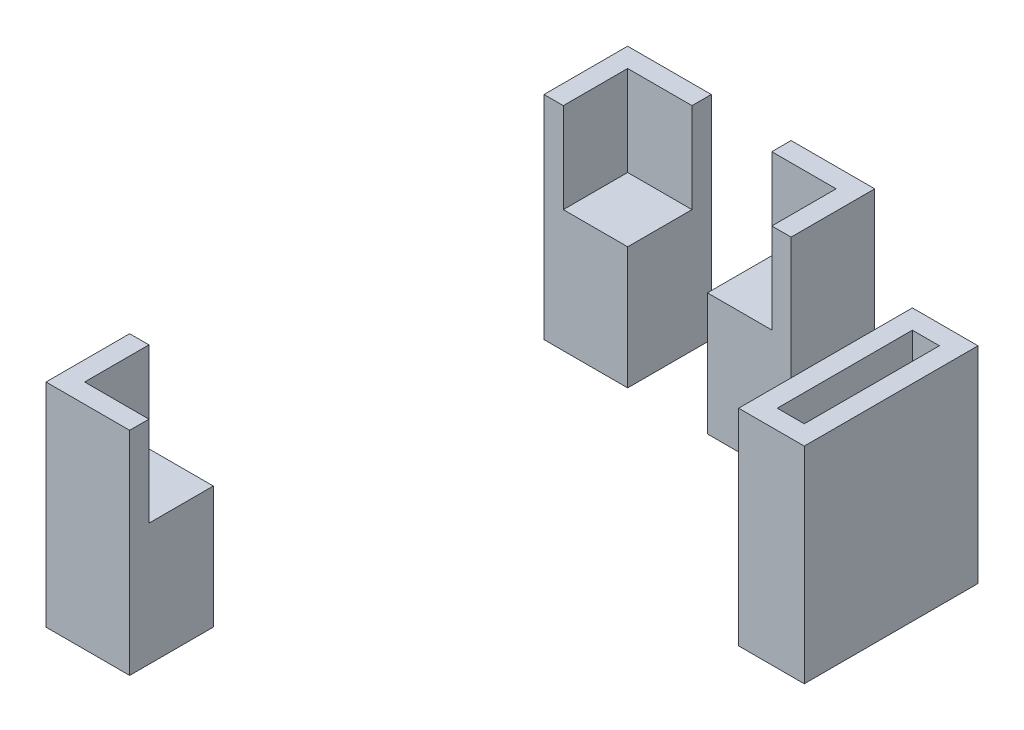
ISO-10303-21;
HEADER;
FILE_DESCRIPTION(('STEP AP214'),'2;1');
FILE_NAME('part.step','',(''),(''),'','','');
FILE_SCHEMA(('AUTOMOTIVE_DESIGN { 1 0 10303 214 1 1 1 1 }'));
ENDSEC;
DATA;
#1=APPLICATION_CONTEXT('core data for automotive mechanical design processes');
#2=APPLICATION_PROTOCOL_DEFINITION('international standard','automotive_design',2000,#1);
#3=PRODUCT_CONTEXT('',#1,'mechanical');
#4=PRODUCT('Part','Part','',(#3));
#5=PRODUCT_RELATED_PRODUCT_CATEGORY('part','',(#4));
#6=PRODUCT_DEFINITION_FORMATION('','',#4);
#7=PRODUCT_DEFINITION_CONTEXT('part definition',#1,'design');
#8=PRODUCT_DEFINITION('design','',#6,#7);
#9=PRODUCT_DEFINITION_SHAPE('','',#8);
#10=(LENGTH_UNIT() NAMED_UNIT(*) SI_UNIT(.MILLI.,.METRE.));
#11=(NAMED_UNIT(*) PLANE_ANGLE_UNIT() SI_UNIT($,.RADIAN.));
#12=(NAMED_UNIT(*) SI_UNIT($,.STERADIAN.) SOLID_ANGLE_UNIT());
#13=UNCERTAINTY_MEASURE_WITH_UNIT(LENGTH_MEASURE(1.E-05),#10,'distance_accuracy_value','');
#14=(GEOMETRIC_REPRESENTATION_CONTEXT(3) GLOBAL_UNCERTAINTY_ASSIGNED_CONTEXT((#13)) GLOBAL_UNIT_ASSIGNED_CONTEXT((#10,
#11,#12)) REPRESENTATION_CONTEXT('',''));
#15=CARTESIAN_POINT('',(0.,0.,0.));
#16=DIRECTION('',(0.,0.,1.));
#17=DIRECTION('',(1.,0.,0.));
#18=AXIS2_PLACEMENT_3D('',#15,#16,#17);
#19=CARTESIAN_POINT('',(26.675,16.5,4.55));
#20=DIRECTION('',(1.,0.,0.));
#21=DIRECTION('',(0.,0.,-1.));
#22=AXIS2_PLACEMENT_3D('',#19,#20,#21);
#23=PLANE('',#22);
#24=DIRECTION('',(0.,0.,1.));
#25=VECTOR('',#24,1.);
#26=CARTESIAN_POINT('',(26.675,16.,4.55));
#27=LINE('',#26,#25);
#28=CARTESIAN_POINT('',(26.675,16.,4.55));
#29=VERTEX_POINT('',#28);
#30=CARTESIAN_POINT('',(26.675,16.,18.05));
#31=VERTEX_POINT('',#30);
#32=EDGE_CURVE('E135',#29,#31,#27,.T.);
#33=ORIENTED_EDGE('',*,*,#32,.F.);
#34=DIRECTION('',(0.,-1.,0.));
#35=VECTOR('',#34,1.);
#36=CARTESIAN_POINT('',(26.675,16.5,4.55));
#37=LINE('',#36,#35);
#38=CARTESIAN_POINT('',(26.675,0.,4.55));
#39=VERTEX_POINT('',#38);
#40=EDGE_CURVE('E168',#29,#39,#37,.T.);
#41=ORIENTED_EDGE('',*,*,#40,.T.);
#42=DIRECTION('',(0.,0.,1.));
#43=VECTOR('',#42,1.);
#44=CARTESIAN_POINT('',(26.675,0.,4.55));
#45=LINE('',#44,#43);
#46=CARTESIAN_POINT('',(26.675,0.,18.05));
#47=VERTEX_POINT('',#46);
#48=EDGE_CURVE('E157',#39,#47,#45,.T.);
#49=ORIENTED_EDGE('',*,*,#48,.T.);
#50=DIRECTION('',(0.,-1.,0.));
#51=VECTOR('',#50,1.);
#52=CARTESIAN_POINT('',(26.675,16.5,18.05));
#53=LINE('',#52,#51);
#54=EDGE_CURVE('E54',#31,#47,#53,.T.);
#55=ORIENTED_EDGE('',*,*,#54,.F.);
#56=EDGE_LOOP('',(#33,#41,#49,#55));
#57=FACE_BOUND('',#56,.T.);
#58=ADVANCED_FACE('F47',(#57),#23,.F.);
#59=CARTESIAN_POINT('',(26.675,16.5,18.05));
#60=DIRECTION('',(0.,0.,-1.));
#61=DIRECTION('',(-1.,0.,0.));
#62=AXIS2_PLACEMENT_3D('',#59,#60,#61);
#63=PLANE('',#62);
#64=DIRECTION('',(1.,0.,0.));
#65=VECTOR('',#64,1.);
#66=CARTESIAN_POINT('',(26.675,16.,18.05));
#67=LINE('',#66,#65);
#68=CARTESIAN_POINT('',(31.775,16.,18.05));
#69=VERTEX_POINT('',#68);
#70=EDGE_CURVE('E138',#31,#69,#67,.T.);
#71=ORIENTED_EDGE('',*,*,#70,.F.);
#72=ORIENTED_EDGE('',*,*,#54,.T.);
#73=DIRECTION('',(1.,0.,0.));
#74=VECTOR('',#73,1.);
#75=CARTESIAN_POINT('',(26.675,0.,18.05));
#76=LINE('',#75,#74);
#77=CARTESIAN_POINT('',(31.775,0.,18.05));
#78=VERTEX_POINT('',#77);
#79=EDGE_CURVE('E160',#47,#78,#76,.T.);
#80=ORIENTED_EDGE('',*,*,#79,.T.);
#81=DIRECTION('',(0.,-1.,0.));
#82=VECTOR('',#81,1.);
#83=CARTESIAN_POINT('',(31.775,16.5,18.05));
#84=LINE('',#83,#82);
#85=EDGE_CURVE('E174',#69,#78,#84,.T.);
#86=ORIENTED_EDGE('',*,*,#85,.F.);
#87=EDGE_LOOP('',(#71,#72,#80,#86));
#88=FACE_BOUND('',#87,.T.);
#89=ADVANCED_FACE('F179',(#88),#63,.F.);
#90=CARTESIAN_POINT('',(31.775,16.5,4.55));
#91=DIRECTION('',(-1.,0.,0.));
#92=DIRECTION('',(0.,0.,1.));
#93=AXIS2_PLACEMENT_3D('',#90,#91,#92);
#94=PLANE('',#93);
#95=DIRECTION('',(0.,0.,-1.));
#96=VECTOR('',#95,1.);
#97=CARTESIAN_POINT('',(31.775,16.,4.55));
#98=LINE('',#97,#96);
#99=CARTESIAN_POINT('',(31.775,16.,4.55));
#100=VERTEX_POINT('',#99);
#101=EDGE_CURVE('E141',#69,#100,#98,.T.);
#102=ORIENTED_EDGE('',*,*,#101,.F.);
#103=ORIENTED_EDGE('',*,*,#85,.T.);
#104=DIRECTION('',(0.,0.,-1.));
#105=VECTOR('',#104,1.);
#106=CARTESIAN_POINT('',(31.775,0.,4.55));
#107=LINE('',#106,#105);
#108=CARTESIAN_POINT('',(31.775,0.,4.55));
#109=VERTEX_POINT('',#108);
#110=EDGE_CURVE('E163',#78,#109,#107,.T.);
#111=ORIENTED_EDGE('',*,*,#110,.T.);
#112=DIRECTION('',(0.,-1.,0.));
#113=VECTOR('',#112,1.);
#114=CARTESIAN_POINT('',(31.775,16.5,4.55));
#115=LINE('',#114,#113);
#116=EDGE_CURVE('E171',#100,#109,#115,.T.);
#117=ORIENTED_EDGE('',*,*,#116,.F.);
#118=EDGE_LOOP('',(#102,#103,#111,#117));
#119=FACE_BOUND('',#118,.T.);
#120=ADVANCED_FACE('F189',(#119),#94,.F.);
#121=CARTESIAN_POINT('',(26.675,16.5,4.55));
#122=DIRECTION('',(0.,0.,1.));
#123=DIRECTION('',(1.,0.,0.));
#124=AXIS2_PLACEMENT_3D('',#121,#122,#123);
#125=PLANE('',#124);
#126=DIRECTION('',(-1.,0.,0.));
#127=VECTOR('',#126,1.);
#128=CARTESIAN_POINT('',(26.675,16.,4.55));
#129=LINE('',#128,#127);
#130=EDGE_CURVE('E144',#100,#29,#129,.T.);
#131=ORIENTED_EDGE('',*,*,#130,.F.);
#132=ORIENTED_EDGE('',*,*,#116,.T.);
#133=DIRECTION('',(-1.,0.,0.));
#134=VECTOR('',#133,1.);
#135=CARTESIAN_POINT('',(26.675,0.,4.55));
#136=LINE('',#135,#134);
#137=EDGE_CURVE('E166',#109,#39,#136,.T.);
#138=ORIENTED_EDGE('',*,*,#137,.T.);
#139=ORIENTED_EDGE('',*,*,#40,.F.);
#140=EDGE_LOOP('',(#131,#132,#138,#139));
#141=FACE_BOUND('',#140,.T.);
#142=ADVANCED_FACE('F193',(#141),#125,.F.);
#143=CARTESIAN_POINT('',(28.175,16.5,6.05));
#144=DIRECTION('',(1.,0.,0.));
#145=DIRECTION('',(0.,0.,-1.));
#146=AXIS2_PLACEMENT_3D('',#143,#144,#145);
#147=PLANE('',#146);
#148=DIRECTION('',(0.,0.,1.));
#149=VECTOR('',#148,1.);
#150=CARTESIAN_POINT('',(28.175,13.,6.05));
#151=LINE('',#150,#149);
#152=CARTESIAN_POINT('',(28.175,13.,6.05));
#153=VERTEX_POINT('',#152);
#154=CARTESIAN_POINT('',(28.175,13.,16.55));
#155=VERTEX_POINT('',#154);
#156=EDGE_CURVE('E116',#153,#155,#151,.T.);
#157=ORIENTED_EDGE('',*,*,#156,.F.);
#158=DIRECTION('',(0.,-1.,0.));
#159=VECTOR('',#158,1.);
#160=CARTESIAN_POINT('',(28.175,16.5,6.05));
#161=LINE('',#160,#159);
#162=CARTESIAN_POINT('',(28.175,16.,6.05));
#163=VERTEX_POINT('',#162);
#164=EDGE_CURVE('E121',#163,#153,#161,.T.);
#165=ORIENTED_EDGE('',*,*,#164,.F.);
#166=DIRECTION('',(0.,0.,1.));
#167=VECTOR('',#166,1.);
#168=CARTESIAN_POINT('',(28.175,16.,6.05));
#169=LINE('',#168,#167);
#170=CARTESIAN_POINT('',(28.175,16.,16.55));
#171=VERTEX_POINT('',#170);
#172=EDGE_CURVE('E127',#163,#171,#169,.T.);
#173=ORIENTED_EDGE('',*,*,#172,.T.);
#174=DIRECTION('',(0.,-1.,0.));
#175=VECTOR('',#174,1.);
#176=CARTESIAN_POINT('',(28.175,16.5,16.55));
#177=LINE('',#176,#175);
#178=EDGE_CURVE('E130',#171,#155,#177,.T.);
#179=ORIENTED_EDGE('',*,*,#178,.T.);
#180=EDGE_LOOP('',(#157,#165,#173,#179));
#181=FACE_BOUND('',#180,.T.);
#182=ADVANCED_FACE('F129',(#181),#147,.T.);
#183=CARTESIAN_POINT('',(28.175,16.5,16.55));
#184=DIRECTION('',(0.,0.,-1.));
#185=DIRECTION('',(-1.,0.,0.));
#186=AXIS2_PLACEMENT_3D('',#183,#184,#185);
#187=PLANE('',#186);
#188=DIRECTION('',(1.,0.,0.));
#189=VECTOR('',#188,1.);
#190=CARTESIAN_POINT('',(28.175,13.,16.55));
#191=LINE('',#190,#189);
#192=CARTESIAN_POINT('',(30.275,13.,16.55));
#193=VERTEX_POINT('',#192);
#194=EDGE_CURVE('E61',#155,#193,#191,.T.);
#195=ORIENTED_EDGE('',*,*,#194,.F.);
#196=ORIENTED_EDGE('',*,*,#178,.F.);
#197=DIRECTION('',(1.,0.,0.));
#198=VECTOR('',#197,1.);
#199=CARTESIAN_POINT('',(28.175,16.,16.55));
#200=LINE('',#199,#198);
#201=CARTESIAN_POINT('',(30.275,16.,16.55));
#202=VERTEX_POINT('',#201);
#203=EDGE_CURVE('E149',#171,#202,#200,.T.);
#204=ORIENTED_EDGE('',*,*,#203,.T.);
#205=DIRECTION('',(0.,-1.,0.));
#206=VECTOR('',#205,1.);
#207=CARTESIAN_POINT('',(30.275,16.5,16.55));
#208=LINE('',#207,#206);
#209=EDGE_CURVE('E154',#202,#193,#208,.T.);
#210=ORIENTED_EDGE('',*,*,#209,.T.);
#211=EDGE_LOOP('',(#195,#196,#204,#210));
#212=FACE_BOUND('',#211,.T.);
#213=ADVANCED_FACE('F200',(#212),#187,.T.);
#214=CARTESIAN_POINT('',(30.275,16.5,6.05));
#215=DIRECTION('',(-1.,0.,0.));
#216=DIRECTION('',(0.,0.,1.));
#217=AXIS2_PLACEMENT_3D('',#214,#215,#216);
#218=PLANE('',#217);
#219=DIRECTION('',(0.,0.,-1.));
#220=VECTOR('',#219,1.);
#221=CARTESIAN_POINT('',(30.275,13.,6.05));
#222=LINE('',#221,#220);
#223=CARTESIAN_POINT('',(30.275,13.,6.05));
#224=VERTEX_POINT('',#223);
#225=EDGE_CURVE('E69',#193,#224,#222,.T.);
#226=ORIENTED_EDGE('',*,*,#225,.F.);
#227=ORIENTED_EDGE('',*,*,#209,.F.);
#228=DIRECTION('',(0.,0.,-1.));
#229=VECTOR('',#228,1.);
#230=CARTESIAN_POINT('',(30.275,16.,6.05));
#231=LINE('',#230,#229);
#232=CARTESIAN_POINT('',(30.275,16.,6.05));
#233=VERTEX_POINT('',#232);
#234=EDGE_CURVE('E146',#202,#233,#231,.T.);
#235=ORIENTED_EDGE('',*,*,#234,.T.);
#236=DIRECTION('',(0.,-1.,0.));
#237=VECTOR('',#236,1.);
#238=CARTESIAN_POINT('',(30.275,16.5,6.05));
#239=LINE('',#238,#237);
#240=EDGE_CURVE('E126',#233,#224,#239,.T.);
#241=ORIENTED_EDGE('',*,*,#240,.T.);
#242=EDGE_LOOP('',(#226,#227,#235,#241));
#243=FACE_BOUND('',#242,.T.);
#244=ADVANCED_FACE('F235',(#243),#218,.T.);
#245=CARTESIAN_POINT('',(28.175,16.5,6.05));
#246=DIRECTION('',(0.,0.,1.));
#247=DIRECTION('',(1.,0.,0.));
#248=AXIS2_PLACEMENT_3D('',#245,#246,#247);
#249=PLANE('',#248);
#250=DIRECTION('',(-1.,0.,0.));
#251=VECTOR('',#250,1.);
#252=CARTESIAN_POINT('',(28.175,13.,6.05));
#253=LINE('',#252,#251);
#254=EDGE_CURVE('E112',#224,#153,#253,.T.);
#255=ORIENTED_EDGE('',*,*,#254,.F.);
#256=ORIENTED_EDGE('',*,*,#240,.F.);
#257=DIRECTION('',(-1.,0.,0.));
#258=VECTOR('',#257,1.);
#259=CARTESIAN_POINT('',(28.175,16.,6.05));
#260=LINE('',#259,#258);
#261=EDGE_CURVE('E13',#233,#163,#260,.T.);
#262=ORIENTED_EDGE('',*,*,#261,.T.);
#263=ORIENTED_EDGE('',*,*,#164,.T.);
#264=EDGE_LOOP('',(#255,#256,#262,#263));
#265=FACE_BOUND('',#264,.T.);
#266=ADVANCED_FACE('F122',(#265),#249,.T.);
#267=CARTESIAN_POINT('',(0.,0.,0.));
#268=DIRECTION('',(0.,1.,0.));
#269=DIRECTION('',(0.,0.,1.));
#270=AXIS2_PLACEMENT_3D('',#267,#268,#269);
#271=PLANE('',#270);
#272=ORIENTED_EDGE('',*,*,#48,.F.);
#273=ORIENTED_EDGE('',*,*,#137,.F.);
#274=ORIENTED_EDGE('',*,*,#110,.F.);
#275=ORIENTED_EDGE('',*,*,#79,.F.);
#276=EDGE_LOOP('',(#272,#273,#274,#275));
#277=FACE_BOUND('',#276,.T.);
#278=ADVANCED_FACE('F186',(#277),#271,.F.);
#279=CARTESIAN_POINT('',(0.,16.,0.));
#280=DIRECTION('',(0.,1.,0.));
#281=DIRECTION('',(0.,0.,1.));
#282=AXIS2_PLACEMENT_3D('',#279,#280,#281);
#283=PLANE('',#282);
#284=ORIENTED_EDGE('',*,*,#261,.F.);
#285=ORIENTED_EDGE('',*,*,#234,.F.);
#286=ORIENTED_EDGE('',*,*,#203,.F.);
#287=ORIENTED_EDGE('',*,*,#172,.F.);
#288=EDGE_LOOP('',(#284,#285,#286,#287));
#289=FACE_BOUND('',#288,.T.);
#290=ORIENTED_EDGE('',*,*,#32,.T.);
#291=ORIENTED_EDGE('',*,*,#70,.T.);
#292=ORIENTED_EDGE('',*,*,#101,.T.);
#293=ORIENTED_EDGE('',*,*,#130,.T.);
#294=EDGE_LOOP('',(#290,#291,#292,#293));
#295=FACE_BOUND('',#294,.T.);
#296=ADVANCED_FACE('F191',(#289,#295),#283,.T.);
#297=CARTESIAN_POINT('',(0.,13.,0.));
#298=DIRECTION('',(0.,1.,0.));
#299=DIRECTION('',(0.,0.,1.));
#300=AXIS2_PLACEMENT_3D('',#297,#298,#299);
#301=PLANE('',#300);
#302=ORIENTED_EDGE('',*,*,#254,.T.);
#303=ORIENTED_EDGE('',*,*,#156,.T.);
#304=ORIENTED_EDGE('',*,*,#194,.T.);
#305=ORIENTED_EDGE('',*,*,#225,.T.);
#306=EDGE_LOOP('',(#302,#303,#304,#305));
#307=FACE_BOUND('',#306,.T.);
#308=ADVANCED_FACE('F114',(#307),#301,.T.);
#309=CLOSED_SHELL('',(#58,#89,#120,#142,#182,#213,#244,#266,#278,#296,#308));
#310=MANIFOLD_SOLID_BREP('B2',#309);
#311=CARTESIAN_POINT('',(-1.5,16.5,37.2));
#312=DIRECTION('',(0.,0.,1.));
#313=DIRECTION('',(1.,0.,0.));
#314=AXIS2_PLACEMENT_3D('',#311,#312,#313);
#315=PLANE('',#314);
#316=DIRECTION('',(-1.,0.,0.));
#317=VECTOR('',#316,1.);
#318=CARTESIAN_POINT('',(-1.5,0.,37.2));
#319=LINE('',#318,#317);
#320=CARTESIAN_POINT('',(5.,0.,37.2));
#321=VERTEX_POINT('',#320);
#322=CARTESIAN_POINT('',(-1.5,0.,37.2));
#323=VERTEX_POINT('',#322);
#324=EDGE_CURVE('E370',#321,#323,#319,.T.);
#325=ORIENTED_EDGE('',*,*,#324,.T.);
#326=DIRECTION('',(0.,-1.,0.));
#327=VECTOR('',#326,1.);
#328=CARTESIAN_POINT('',(-1.5,16.5,37.2));
#329=LINE('',#328,#327);
#330=CARTESIAN_POINT('',(-1.5,16.5,37.2));
#331=VERTEX_POINT('',#330);
#332=EDGE_CURVE('E45',#331,#323,#329,.T.);
#333=ORIENTED_EDGE('',*,*,#332,.F.);
#334=DIRECTION('',(-1.,0.,0.));
#335=VECTOR('',#334,1.);
#336=CARTESIAN_POINT('',(-1.5,16.5,37.2));
#337=LINE('',#336,#335);
#338=CARTESIAN_POINT('',(0.,16.5,37.2));
#339=VERTEX_POINT('',#338);
#340=EDGE_CURVE('E378',#339,#331,#337,.T.);
#341=ORIENTED_EDGE('',*,*,#340,.F.);
#342=DIRECTION('',(0.,-1.,0.));
#343=VECTOR('',#342,1.);
#344=CARTESIAN_POINT('',(0.,16.5,37.2));
#345=LINE('',#344,#343);
#346=CARTESIAN_POINT('',(0.,9.5,37.2));
#347=VERTEX_POINT('',#346);
#348=EDGE_CURVE('E374',#339,#347,#345,.T.);
#349=ORIENTED_EDGE('',*,*,#348,.T.);
#350=DIRECTION('',(-1.,0.,0.));
#351=VECTOR('',#350,1.);
#352=CARTESIAN_POINT('',(0.,9.5,37.2));
#353=LINE('',#352,#351);
#354=CARTESIAN_POINT('',(5.,9.5,37.2));
#355=VERTEX_POINT('',#354);
#356=EDGE_CURVE('E357',#355,#347,#353,.T.);
#357=ORIENTED_EDGE('',*,*,#356,.F.);
#358=DIRECTION('',(0.,-1.,0.));
#359=VECTOR('',#358,1.);
#360=CARTESIAN_POINT('',(5.,9.5,37.2));
#361=LINE('',#360,#359);
#362=EDGE_CURVE('E363',#355,#321,#361,.T.);
#363=ORIENTED_EDGE('',*,*,#362,.T.);
#364=EDGE_LOOP('',(#325,#333,#341,#349,#357,#363));
#365=FACE_BOUND('',#364,.T.);
#366=ADVANCED_FACE('F298',(#365),#315,.F.);
#367=CARTESIAN_POINT('',(-1.5,16.5,37.2));
#368=DIRECTION('',(1.,0.,0.));
#369=DIRECTION('',(0.,0.,-1.));
#370=AXIS2_PLACEMENT_3D('',#367,#368,#369);
#371=PLANE('',#370);
#372=DIRECTION('',(0.,0.,1.));
#373=VECTOR('',#372,1.);
#374=CARTESIAN_POINT('',(-1.5,0.,37.2));
#375=LINE('',#374,#373);
#376=CARTESIAN_POINT('',(-1.5,0.,43.7));
#377=VERTEX_POINT('',#376);
#378=EDGE_CURVE('E396',#323,#377,#375,.T.);
#379=ORIENTED_EDGE('',*,*,#378,.T.);
#380=DIRECTION('',(0.,-1.,0.));
#381=VECTOR('',#380,1.);
#382=CARTESIAN_POINT('',(-1.5,16.5,43.7));
#383=LINE('',#382,#381);
#384=CARTESIAN_POINT('',(-1.5,16.5,43.7));
#385=VERTEX_POINT('',#384);
#386=EDGE_CURVE('E305',#385,#377,#383,.T.);
#387=ORIENTED_EDGE('',*,*,#386,.F.);
#388=DIRECTION('',(0.,0.,1.));
#389=VECTOR('',#388,1.);
#390=CARTESIAN_POINT('',(-1.5,16.5,37.2));
#391=LINE('',#390,#389);
#392=EDGE_CURVE('E381',#331,#385,#391,.T.);
#393=ORIENTED_EDGE('',*,*,#392,.F.);
#394=ORIENTED_EDGE('',*,*,#332,.T.);
#395=EDGE_LOOP('',(#379,#387,#393,#394));
#396=FACE_BOUND('',#395,.T.);
#397=ADVANCED_FACE('F415',(#396),#371,.F.);
#398=CARTESIAN_POINT('',(-1.5,16.5,43.7));
#399=DIRECTION('',(0.,0.,-1.));
#400=DIRECTION('',(-1.,0.,0.));
#401=AXIS2_PLACEMENT_3D('',#398,#399,#400);
#402=PLANE('',#401);
#403=DIRECTION('',(1.,0.,0.));
#404=VECTOR('',#403,1.);
#405=CARTESIAN_POINT('',(-1.5,0.,43.7));
#406=LINE('',#405,#404);
#407=CARTESIAN_POINT('',(5.,0.,43.7));
#408=VERTEX_POINT('',#407);
#409=EDGE_CURVE('E399',#377,#408,#406,.T.);
#410=ORIENTED_EDGE('',*,*,#409,.T.);
#411=DIRECTION('',(0.,-1.,0.));
#412=VECTOR('',#411,1.);
#413=CARTESIAN_POINT('',(5.,16.5,43.7));
#414=LINE('',#413,#412);
#415=CARTESIAN_POINT('',(5.,16.5,43.7));
#416=VERTEX_POINT('',#415);
#417=EDGE_CURVE('E408',#416,#408,#414,.T.);
#418=ORIENTED_EDGE('',*,*,#417,.F.);
#419=DIRECTION('',(1.,0.,0.));
#420=VECTOR('',#419,1.);
#421=CARTESIAN_POINT('',(-1.5,16.5,43.7));
#422=LINE('',#421,#420);
#423=EDGE_CURVE('E384',#385,#416,#422,.T.);
#424=ORIENTED_EDGE('',*,*,#423,.F.);
#425=ORIENTED_EDGE('',*,*,#386,.T.);
#426=EDGE_LOOP('',(#410,#418,#424,#425));
#427=FACE_BOUND('',#426,.T.);
#428=ADVANCED_FACE('F412',(#427),#402,.F.);
#429=CARTESIAN_POINT('',(5.,16.5,42.2));
#430=DIRECTION('',(-1.,0.,0.));
#431=DIRECTION('',(0.,0.,1.));
#432=AXIS2_PLACEMENT_3D('',#429,#430,#431);
#433=PLANE('',#432);
#434=DIRECTION('',(0.,0.,-1.));
#435=VECTOR('',#434,1.);
#436=CARTESIAN_POINT('',(5.,0.,42.2));
#437=LINE('',#436,#435);
#438=EDGE_CURVE('E366',#408,#321,#437,.T.);
#439=ORIENTED_EDGE('',*,*,#438,.T.);
#440=ORIENTED_EDGE('',*,*,#362,.F.);
#441=DIRECTION('',(0.,0.,-1.));
#442=VECTOR('',#441,1.);
#443=CARTESIAN_POINT('',(5.,9.5,37.2));
#444=LINE('',#443,#442);
#445=CARTESIAN_POINT('',(5.,9.5,42.2));
#446=VERTEX_POINT('',#445);
#447=EDGE_CURVE('E353',#446,#355,#444,.T.);
#448=ORIENTED_EDGE('',*,*,#447,.F.);
#449=DIRECTION('',(0.,-1.,0.));
#450=VECTOR('',#449,1.);
#451=CARTESIAN_POINT('',(5.,16.5,42.2));
#452=LINE('',#451,#450);
#453=CARTESIAN_POINT('',(5.,16.5,42.2));
#454=VERTEX_POINT('',#453);
#455=EDGE_CURVE('E406',#454,#446,#452,.T.);
#456=ORIENTED_EDGE('',*,*,#455,.F.);
#457=DIRECTION('',(0.,0.,-1.));
#458=VECTOR('',#457,1.);
#459=CARTESIAN_POINT('',(5.,16.5,42.2));
#460=LINE('',#459,#458);
#461=EDGE_CURVE('E387',#416,#454,#460,.T.);
#462=ORIENTED_EDGE('',*,*,#461,.F.);
#463=ORIENTED_EDGE('',*,*,#417,.T.);
#464=EDGE_LOOP('',(#439,#440,#448,#456,#462,#463));
#465=FACE_BOUND('',#464,.T.);
#466=ADVANCED_FACE('F364',(#465),#433,.F.);
#467=CARTESIAN_POINT('',(0.,16.5,42.2));
#468=DIRECTION('',(0.,0.,1.));
#469=DIRECTION('',(1.,0.,0.));
#470=AXIS2_PLACEMENT_3D('',#467,#468,#469);
#471=PLANE('',#470);
#472=ORIENTED_EDGE('',*,*,#455,.T.);
#473=DIRECTION('',(1.,0.,0.));
#474=VECTOR('',#473,1.);
#475=CARTESIAN_POINT('',(0.,9.5,42.2));
#476=LINE('',#475,#474);
#477=CARTESIAN_POINT('',(0.,9.5,42.2));
#478=VERTEX_POINT('',#477);
#479=EDGE_CURVE('E312',#478,#446,#476,.T.);
#480=ORIENTED_EDGE('',*,*,#479,.F.);
#481=DIRECTION('',(0.,-1.,0.));
#482=VECTOR('',#481,1.);
#483=CARTESIAN_POINT('',(0.,16.5,42.2));
#484=LINE('',#483,#482);
#485=CARTESIAN_POINT('',(0.,16.5,42.2));
#486=VERTEX_POINT('',#485);
#487=EDGE_CURVE('E404',#486,#478,#484,.T.);
#488=ORIENTED_EDGE('',*,*,#487,.F.);
#489=DIRECTION('',(-1.,0.,0.));
#490=VECTOR('',#489,1.);
#491=CARTESIAN_POINT('',(0.,16.5,42.2));
#492=LINE('',#491,#490);
#493=EDGE_CURVE('E390',#454,#486,#492,.T.);
#494=ORIENTED_EDGE('',*,*,#493,.F.);
#495=EDGE_LOOP('',(#472,#480,#488,#494));
#496=FACE_BOUND('',#495,.T.);
#497=ADVANCED_FACE('F426',(#496),#471,.F.);
#498=CARTESIAN_POINT('',(0.,16.5,37.2));
#499=DIRECTION('',(-1.,0.,0.));
#500=DIRECTION('',(0.,0.,1.));
#501=AXIS2_PLACEMENT_3D('',#498,#499,#500);
#502=PLANE('',#501);
#503=ORIENTED_EDGE('',*,*,#487,.T.);
#504=DIRECTION('',(0.,0.,1.));
#505=VECTOR('',#504,1.);
#506=CARTESIAN_POINT('',(0.,9.5,37.2));
#507=LINE('',#506,#505);
#508=EDGE_CURVE('E317',#347,#478,#507,.T.);
#509=ORIENTED_EDGE('',*,*,#508,.F.);
#510=ORIENTED_EDGE('',*,*,#348,.F.);
#511=DIRECTION('',(0.,0.,-1.));
#512=VECTOR('',#511,1.);
#513=CARTESIAN_POINT('',(0.,16.5,37.2));
#514=LINE('',#513,#512);
#515=EDGE_CURVE('E393',#486,#339,#514,.T.);
#516=ORIENTED_EDGE('',*,*,#515,.F.);
#517=EDGE_LOOP('',(#503,#509,#510,#516));
#518=FACE_BOUND('',#517,.T.);
#519=ADVANCED_FACE('F423',(#518),#502,.F.);
#520=CARTESIAN_POINT('',(0.,16.5,0.));
#521=DIRECTION('',(0.,-1.,0.));
#522=DIRECTION('',(0.,0.,-1.));
#523=AXIS2_PLACEMENT_3D('',#520,#521,#522);
#524=PLANE('',#523);
#525=ORIENTED_EDGE('',*,*,#340,.T.);
#526=ORIENTED_EDGE('',*,*,#392,.T.);
#527=ORIENTED_EDGE('',*,*,#423,.T.);
#528=ORIENTED_EDGE('',*,*,#461,.T.);
#529=ORIENTED_EDGE('',*,*,#493,.T.);
#530=ORIENTED_EDGE('',*,*,#515,.T.);
#531=EDGE_LOOP('',(#525,#526,#527,#528,#529,#530));
#532=FACE_BOUND('',#531,.T.);
#533=ADVANCED_FACE('F420',(#532),#524,.F.);
#534=CARTESIAN_POINT('',(0.,0.,0.));
#535=DIRECTION('',(0.,-1.,0.));
#536=DIRECTION('',(0.,0.,-1.));
#537=AXIS2_PLACEMENT_3D('',#534,#535,#536);
#538=PLANE('',#537);
#539=ORIENTED_EDGE('',*,*,#324,.F.);
#540=ORIENTED_EDGE('',*,*,#438,.F.);
#541=ORIENTED_EDGE('',*,*,#409,.F.);
#542=ORIENTED_EDGE('',*,*,#378,.F.);
#543=EDGE_LOOP('',(#539,#540,#541,#542));
#544=FACE_BOUND('',#543,.T.);
#545=ADVANCED_FACE('F418',(#544),#538,.T.);
#546=CARTESIAN_POINT('',(0.,9.5,0.));
#547=DIRECTION('',(0.,1.,0.));
#548=DIRECTION('',(0.,0.,1.));
#549=AXIS2_PLACEMENT_3D('',#546,#547,#548);
#550=PLANE('',#549);
#551=ORIENTED_EDGE('',*,*,#508,.T.);
#552=ORIENTED_EDGE('',*,*,#479,.T.);
#553=ORIENTED_EDGE('',*,*,#447,.T.);
#554=ORIENTED_EDGE('',*,*,#356,.T.);
#555=EDGE_LOOP('',(#551,#552,#553,#554));
#556=FACE_BOUND('',#555,.T.);
#557=ADVANCED_FACE('F355',(#556),#550,.T.);
#558=CLOSED_SHELL('',(#366,#397,#428,#466,#497,#519,#533,#545,#557));
#559=MANIFOLD_SOLID_BREP('B7',#558);
#560=CARTESIAN_POINT('',(11.2,16.5,0.));
#561=DIRECTION('',(1.,0.,0.));
#562=DIRECTION('',(0.,0.,-1.));
#563=AXIS2_PLACEMENT_3D('',#560,#561,#562);
#564=PLANE('',#563);
#565=DIRECTION('',(0.,0.,1.));
#566=VECTOR('',#565,1.);
#567=CARTESIAN_POINT('',(11.2,0.,0.));
#568=LINE('',#567,#566);
#569=CARTESIAN_POINT('',(11.2,0.,-1.5));
#570=VERTEX_POINT('',#569);
#571=CARTESIAN_POINT('',(11.2,0.,5.));
#572=VERTEX_POINT('',#571);
#573=EDGE_CURVE('E591',#570,#572,#568,.T.);
#574=ORIENTED_EDGE('',*,*,#573,.T.);
#575=DIRECTION('',(0.,-1.,0.));
#576=VECTOR('',#575,1.);
#577=CARTESIAN_POINT('',(11.2,9.5,5.));
#578=LINE('',#577,#576);
#579=CARTESIAN_POINT('',(11.2,9.5,5.));
#580=VERTEX_POINT('',#579);
#581=EDGE_CURVE('E578',#580,#572,#578,.T.);
#582=ORIENTED_EDGE('',*,*,#581,.F.);
#583=DIRECTION('',(0.,0.,1.));
#584=VECTOR('',#583,1.);
#585=CARTESIAN_POINT('',(11.2,9.5,0.));
#586=LINE('',#585,#584);
#587=CARTESIAN_POINT('',(11.2,9.5,0.));
#588=VERTEX_POINT('',#587);
#589=EDGE_CURVE('E582',#588,#580,#586,.T.);
#590=ORIENTED_EDGE('',*,*,#589,.F.);
#591=DIRECTION('',(0.,-1.,0.));
#592=VECTOR('',#591,1.);
#593=CARTESIAN_POINT('',(11.2,16.5,0.));
#594=LINE('',#593,#592);
#595=CARTESIAN_POINT('',(11.2,16.5,0.));
#596=VERTEX_POINT('',#595);
#597=EDGE_CURVE('E296',#596,#588,#594,.T.);
#598=ORIENTED_EDGE('',*,*,#597,.F.);
#599=DIRECTION('',(0.,0.,1.));
#600=VECTOR('',#599,1.);
#601=CARTESIAN_POINT('',(11.2,16.5,0.));
#602=LINE('',#601,#600);
#603=CARTESIAN_POINT('',(11.2,16.5,-1.5));
#604=VERTEX_POINT('',#603);
#605=EDGE_CURVE('E598',#604,#596,#602,.T.);
#606=ORIENTED_EDGE('',*,*,#605,.F.);
#607=DIRECTION('',(0.,-1.,0.));
#608=VECTOR('',#607,1.);
#609=CARTESIAN_POINT('',(11.2,16.5,-1.5));
#610=LINE('',#609,#608);
#611=EDGE_CURVE('E615',#604,#570,#610,.T.);
#612=ORIENTED_EDGE('',*,*,#611,.T.);
#613=EDGE_LOOP('',(#574,#582,#590,#598,#606,#612));
#614=FACE_BOUND('',#613,.T.);
#615=ADVANCED_FACE('F517',(#614),#564,.F.);
#616=CARTESIAN_POINT('',(11.2,16.5,0.));
#617=DIRECTION('',(0.,0.,-1.));
#618=DIRECTION('',(-1.,0.,0.));
#619=AXIS2_PLACEMENT_3D('',#616,#617,#618);
#620=PLANE('',#619);
#621=ORIENTED_EDGE('',*,*,#597,.T.);
#622=DIRECTION('',(-1.,0.,0.));
#623=VECTOR('',#622,1.);
#624=CARTESIAN_POINT('',(11.2,9.5,0.));
#625=LINE('',#624,#623);
#626=CARTESIAN_POINT('',(16.2,9.5,0.));
#627=VERTEX_POINT('',#626);
#628=EDGE_CURVE('E531',#627,#588,#625,.T.);
#629=ORIENTED_EDGE('',*,*,#628,.F.);
#630=DIRECTION('',(0.,-1.,0.));
#631=VECTOR('',#630,1.);
#632=CARTESIAN_POINT('',(16.2,16.5,0.));
#633=LINE('',#632,#631);
#634=CARTESIAN_POINT('',(16.2,16.5,0.));
#635=VERTEX_POINT('',#634);
#636=EDGE_CURVE('E524',#635,#627,#633,.T.);
#637=ORIENTED_EDGE('',*,*,#636,.F.);
#638=DIRECTION('',(1.,0.,0.));
#639=VECTOR('',#638,1.);
#640=CARTESIAN_POINT('',(11.2,16.5,0.));
#641=LINE('',#640,#639);
#642=EDGE_CURVE('E601',#596,#635,#641,.T.);
#643=ORIENTED_EDGE('',*,*,#642,.F.);
#644=EDGE_LOOP('',(#621,#629,#637,#643));
#645=FACE_BOUND('',#644,.T.);
#646=ADVANCED_FACE('F633',(#645),#620,.F.);
#647=CARTESIAN_POINT('',(16.2,16.5,0.));
#648=DIRECTION('',(1.,0.,0.));
#649=DIRECTION('',(0.,0.,-1.));
#650=AXIS2_PLACEMENT_3D('',#647,#648,#649);
#651=PLANE('',#650);
#652=ORIENTED_EDGE('',*,*,#636,.T.);
#653=DIRECTION('',(0.,0.,-1.));
#654=VECTOR('',#653,1.);
#655=CARTESIAN_POINT('',(16.2,9.5,0.));
#656=LINE('',#655,#654);
#657=CARTESIAN_POINT('',(16.2,9.5,5.));
#658=VERTEX_POINT('',#657);
#659=EDGE_CURVE('E535',#658,#627,#656,.T.);
#660=ORIENTED_EDGE('',*,*,#659,.F.);
#661=DIRECTION('',(0.,-1.,0.));
#662=VECTOR('',#661,1.);
#663=CARTESIAN_POINT('',(16.2,16.5,5.));
#664=LINE('',#663,#662);
#665=CARTESIAN_POINT('',(16.2,16.5,5.));
#666=VERTEX_POINT('',#665);
#667=EDGE_CURVE('E581',#666,#658,#664,.T.);
#668=ORIENTED_EDGE('',*,*,#667,.F.);
#669=DIRECTION('',(0.,0.,1.));
#670=VECTOR('',#669,1.);
#671=CARTESIAN_POINT('',(16.2,16.5,0.));
#672=LINE('',#671,#670);
#673=EDGE_CURVE('E605',#635,#666,#672,.T.);
#674=ORIENTED_EDGE('',*,*,#673,.F.);
#675=EDGE_LOOP('',(#652,#660,#668,#674));
#676=FACE_BOUND('',#675,.T.);
#677=ADVANCED_FACE('F631',(#676),#651,.F.);
#678=CARTESIAN_POINT('',(17.7,16.5,5.));
#679=DIRECTION('',(0.,0.,-1.));
#680=DIRECTION('',(-1.,0.,0.));
#681=AXIS2_PLACEMENT_3D('',#678,#679,#680);
#682=PLANE('',#681);
#683=DIRECTION('',(1.,0.,0.));
#684=VECTOR('',#683,1.);
#685=CARTESIAN_POINT('',(17.7,0.,5.));
#686=LINE('',#685,#684);
#687=CARTESIAN_POINT('',(17.7,0.,5.));
#688=VERTEX_POINT('',#687);
#689=EDGE_CURVE('E593',#572,#688,#686,.T.);
#690=ORIENTED_EDGE('',*,*,#689,.T.);
#691=DIRECTION('',(0.,-1.,0.));
#692=VECTOR('',#691,1.);
#693=CARTESIAN_POINT('',(17.7,16.5,5.));
#694=LINE('',#693,#692);
#695=CARTESIAN_POINT('',(17.7,16.5,5.));
#696=VERTEX_POINT('',#695);
#697=EDGE_CURVE('E626',#696,#688,#694,.T.);
#698=ORIENTED_EDGE('',*,*,#697,.F.);
#699=DIRECTION('',(1.,0.,0.));
#700=VECTOR('',#699,1.);
#701=CARTESIAN_POINT('',(17.7,16.5,5.));
#702=LINE('',#701,#700);
#703=EDGE_CURVE('E608',#666,#696,#702,.T.);
#704=ORIENTED_EDGE('',*,*,#703,.F.);
#705=ORIENTED_EDGE('',*,*,#667,.T.);
#706=DIRECTION('',(1.,0.,0.));
#707=VECTOR('',#706,1.);
#708=CARTESIAN_POINT('',(11.2,9.5,5.));
#709=LINE('',#708,#707);
#710=EDGE_CURVE('E574',#580,#658,#709,.T.);
#711=ORIENTED_EDGE('',*,*,#710,.F.);
#712=ORIENTED_EDGE('',*,*,#581,.T.);
#713=EDGE_LOOP('',(#690,#698,#704,#705,#711,#712));
#714=FACE_BOUND('',#713,.T.);
#715=ADVANCED_FACE('F576',(#714),#682,.F.);
#716=CARTESIAN_POINT('',(17.7,16.5,-1.5));
#717=DIRECTION('',(-1.,0.,0.));
#718=DIRECTION('',(0.,0.,1.));
#719=AXIS2_PLACEMENT_3D('',#716,#717,#718);
#720=PLANE('',#719);
#721=DIRECTION('',(0.,0.,-1.));
#722=VECTOR('',#721,1.);
#723=CARTESIAN_POINT('',(17.7,0.,-1.5));
#724=LINE('',#723,#722);
#725=CARTESIAN_POINT('',(17.7,0.,-1.5));
#726=VERTEX_POINT('',#725);
#727=EDGE_CURVE('E618',#688,#726,#724,.T.);
#728=ORIENTED_EDGE('',*,*,#727,.T.);
#729=DIRECTION('',(0.,-1.,0.));
#730=VECTOR('',#729,1.);
#731=CARTESIAN_POINT('',(17.7,16.5,-1.5));
#732=LINE('',#731,#730);
#733=CARTESIAN_POINT('',(17.7,16.5,-1.5));
#734=VERTEX_POINT('',#733);
#735=EDGE_CURVE('E623',#734,#726,#732,.T.);
#736=ORIENTED_EDGE('',*,*,#735,.F.);
#737=DIRECTION('',(0.,0.,-1.));
#738=VECTOR('',#737,1.);
#739=CARTESIAN_POINT('',(17.7,16.5,-1.5));
#740=LINE('',#739,#738);
#741=EDGE_CURVE('E611',#696,#734,#740,.T.);
#742=ORIENTED_EDGE('',*,*,#741,.F.);
#743=ORIENTED_EDGE('',*,*,#697,.T.);
#744=EDGE_LOOP('',(#728,#736,#742,#743));
#745=FACE_BOUND('',#744,.T.);
#746=ADVANCED_FACE('F645',(#745),#720,.F.);
#747=CARTESIAN_POINT('',(11.2,16.5,-1.5));
#748=DIRECTION('',(0.,0.,1.));
#749=DIRECTION('',(1.,0.,0.));
#750=AXIS2_PLACEMENT_3D('',#747,#748,#749);
#751=PLANE('',#750);
#752=DIRECTION('',(-1.,0.,0.));
#753=VECTOR('',#752,1.);
#754=CARTESIAN_POINT('',(11.2,0.,-1.5));
#755=LINE('',#754,#753);
#756=EDGE_CURVE('E602',#726,#570,#755,.T.);
#757=ORIENTED_EDGE('',*,*,#756,.T.);
#758=ORIENTED_EDGE('',*,*,#611,.F.);
#759=DIRECTION('',(-1.,0.,0.));
#760=VECTOR('',#759,1.);
#761=CARTESIAN_POINT('',(11.2,16.5,-1.5));
#762=LINE('',#761,#760);
#763=EDGE_CURVE('E614',#734,#604,#762,.T.);
#764=ORIENTED_EDGE('',*,*,#763,.F.);
#765=ORIENTED_EDGE('',*,*,#735,.T.);
#766=EDGE_LOOP('',(#757,#758,#764,#765));
#767=FACE_BOUND('',#766,.T.);
#768=ADVANCED_FACE('F640',(#767),#751,.F.);
#769=CARTESIAN_POINT('',(0.,16.5,0.));
#770=DIRECTION('',(0.,-1.,0.));
#771=DIRECTION('',(0.,0.,-1.));
#772=AXIS2_PLACEMENT_3D('',#769,#770,#771);
#773=PLANE('',#772);
#774=ORIENTED_EDGE('',*,*,#605,.T.);
#775=ORIENTED_EDGE('',*,*,#642,.T.);
#776=ORIENTED_EDGE('',*,*,#673,.T.);
#777=ORIENTED_EDGE('',*,*,#703,.T.);
#778=ORIENTED_EDGE('',*,*,#741,.T.);
#779=ORIENTED_EDGE('',*,*,#763,.T.);
#780=EDGE_LOOP('',(#774,#775,#776,#777,#778,#779));
#781=FACE_BOUND('',#780,.T.);
#782=ADVANCED_FACE('F637',(#781),#773,.F.);
#783=CARTESIAN_POINT('',(0.,0.,0.));
#784=DIRECTION('',(0.,-1.,0.));
#785=DIRECTION('',(0.,0.,-1.));
#786=AXIS2_PLACEMENT_3D('',#783,#784,#785);
#787=PLANE('',#786);
#788=ORIENTED_EDGE('',*,*,#689,.F.);
#789=ORIENTED_EDGE('',*,*,#573,.F.);
#790=ORIENTED_EDGE('',*,*,#756,.F.);
#791=ORIENTED_EDGE('',*,*,#727,.F.);
#792=EDGE_LOOP('',(#788,#789,#790,#791));
#793=FACE_BOUND('',#792,.T.);
#794=ADVANCED_FACE('F642',(#793),#787,.T.);
#795=CARTESIAN_POINT('',(0.,9.5,0.));
#796=DIRECTION('',(0.,1.,0.));
#797=DIRECTION('',(0.,0.,1.));
#798=AXIS2_PLACEMENT_3D('',#795,#796,#797);
#799=PLANE('',#798);
#800=ORIENTED_EDGE('',*,*,#589,.T.);
#801=ORIENTED_EDGE('',*,*,#710,.T.);
#802=ORIENTED_EDGE('',*,*,#659,.T.);
#803=ORIENTED_EDGE('',*,*,#628,.T.);
#804=EDGE_LOOP('',(#800,#801,#802,#803));
#805=FACE_BOUND('',#804,.T.);
#806=ADVANCED_FACE('F585',(#805),#799,.T.);
#807=CLOSED_SHELL('',(#615,#646,#677,#715,#746,#768,#782,#794,#806));
#808=MANIFOLD_SOLID_BREP('B39',#807);
#809=CARTESIAN_POINT('',(0.,16.5,0.));
#810=DIRECTION('',(0.,0.,-1.));
#811=DIRECTION('',(-1.,0.,0.));
#812=AXIS2_PLACEMENT_3D('',#809,#810,#811);
#813=PLANE('',#812);
#814=DIRECTION('',(-1.,0.,0.));
#815=VECTOR('',#814,1.);
#816=CARTESIAN_POINT('',(0.,9.5,0.));
#817=LINE('',#816,#815);
#818=CARTESIAN_POINT('',(5.,9.5,0.));
#819=VERTEX_POINT('',#818);
#820=CARTESIAN_POINT('',(0.,9.5,0.));
#821=VERTEX_POINT('',#820);
#822=EDGE_CURVE('E796',#819,#821,#817,.T.);
#823=ORIENTED_EDGE('',*,*,#822,.F.);
#824=DIRECTION('',(0.,-1.,0.));
#825=VECTOR('',#824,1.);
#826=CARTESIAN_POINT('',(5.,16.5,0.));
#827=LINE('',#826,#825);
#828=CARTESIAN_POINT('',(5.,16.5,0.));
#829=VERTEX_POINT('',#828);
#830=EDGE_CURVE('E515',#829,#819,#827,.T.);
#831=ORIENTED_EDGE('',*,*,#830,.F.);
#832=DIRECTION('',(1.,0.,0.));
#833=VECTOR('',#832,1.);
#834=CARTESIAN_POINT('',(0.,16.5,0.));
#835=LINE('',#834,#833);
#836=CARTESIAN_POINT('',(0.,16.5,0.));
#837=VERTEX_POINT('',#836);
#838=EDGE_CURVE('E805',#837,#829,#835,.T.);
#839=ORIENTED_EDGE('',*,*,#838,.F.);
#840=DIRECTION('',(0.,-1.,0.));
#841=VECTOR('',#840,1.);
#842=CARTESIAN_POINT('',(0.,16.5,0.));
#843=LINE('',#842,#841);
#844=EDGE_CURVE('E821',#837,#821,#843,.T.);
#845=ORIENTED_EDGE('',*,*,#844,.T.);
#846=EDGE_LOOP('',(#823,#831,#839,#845));
#847=FACE_BOUND('',#846,.T.);
#848=ADVANCED_FACE('F727',(#847),#813,.F.);
#849=CARTESIAN_POINT('',(0.,16.5,0.));
#850=DIRECTION('',(-1.,0.,0.));
#851=DIRECTION('',(0.,0.,1.));
#852=AXIS2_PLACEMENT_3D('',#849,#850,#851);
#853=PLANE('',#852);
#854=DIRECTION('',(0.,0.,1.));
#855=VECTOR('',#854,1.);
#856=CARTESIAN_POINT('',(0.,9.5,5.));
#857=LINE('',#856,#855);
#858=CARTESIAN_POINT('',(0.,9.5,5.));
#859=VERTEX_POINT('',#858);
#860=EDGE_CURVE('E785',#821,#859,#857,.T.);
#861=ORIENTED_EDGE('',*,*,#860,.F.);
#862=ORIENTED_EDGE('',*,*,#844,.F.);
#863=DIRECTION('',(0.,0.,-1.));
#864=VECTOR('',#863,1.);
#865=CARTESIAN_POINT('',(0.,16.5,0.));
#866=LINE('',#865,#864);
#867=CARTESIAN_POINT('',(0.,16.5,5.));
#868=VERTEX_POINT('',#867);
#869=EDGE_CURVE('E819',#868,#837,#866,.T.);
#870=ORIENTED_EDGE('',*,*,#869,.F.);
#871=DIRECTION('',(0.,-1.,0.));
#872=VECTOR('',#871,1.);
#873=CARTESIAN_POINT('',(0.,16.5,5.));
#874=LINE('',#873,#872);
#875=EDGE_CURVE('E832',#868,#859,#874,.T.);
#876=ORIENTED_EDGE('',*,*,#875,.T.);
#877=EDGE_LOOP('',(#861,#862,#870,#876));
#878=FACE_BOUND('',#877,.T.);
#879=ADVANCED_FACE('F855',(#878),#853,.F.);
#880=CARTESIAN_POINT('',(5.,16.5,-1.5));
#881=DIRECTION('',(-1.,0.,0.));
#882=DIRECTION('',(0.,0.,1.));
#883=AXIS2_PLACEMENT_3D('',#880,#881,#882);
#884=PLANE('',#883);
#885=DIRECTION('',(0.,0.,-1.));
#886=VECTOR('',#885,1.);
#887=CARTESIAN_POINT('',(5.,0.,-1.5));
#888=LINE('',#887,#886);
#889=CARTESIAN_POINT('',(5.,0.,5.));
#890=VERTEX_POINT('',#889);
#891=CARTESIAN_POINT('',(5.,0.,-1.5));
#892=VERTEX_POINT('',#891);
#893=EDGE_CURVE('E795',#890,#892,#888,.T.);
#894=ORIENTED_EDGE('',*,*,#893,.T.);
#895=DIRECTION('',(0.,-1.,0.));
#896=VECTOR('',#895,1.);
#897=CARTESIAN_POINT('',(5.,16.5,-1.5));
#898=LINE('',#897,#896);
#899=CARTESIAN_POINT('',(5.,16.5,-1.5));
#900=VERTEX_POINT('',#899);
#901=EDGE_CURVE('E734',#900,#892,#898,.T.);
#902=ORIENTED_EDGE('',*,*,#901,.F.);
#903=DIRECTION('',(0.,0.,-1.));
#904=VECTOR('',#903,1.);
#905=CARTESIAN_POINT('',(5.,16.5,-1.5));
#906=LINE('',#905,#904);
#907=EDGE_CURVE('E808',#829,#900,#906,.T.);
#908=ORIENTED_EDGE('',*,*,#907,.F.);
#909=ORIENTED_EDGE('',*,*,#830,.T.);
#910=DIRECTION('',(0.,0.,-1.));
#911=VECTOR('',#910,1.);
#912=CARTESIAN_POINT('',(5.,9.5,5.));
#913=LINE('',#912,#911);
#914=CARTESIAN_POINT('',(5.,9.5,5.));
#915=VERTEX_POINT('',#914);
#916=EDGE_CURVE('E741',#915,#819,#913,.T.);
#917=ORIENTED_EDGE('',*,*,#916,.F.);
#918=DIRECTION('',(0.,-1.,0.));
#919=VECTOR('',#918,1.);
#920=CARTESIAN_POINT('',(5.,9.5,5.));
#921=LINE('',#920,#919);
#922=EDGE_CURVE('E788',#915,#890,#921,.T.);
#923=ORIENTED_EDGE('',*,*,#922,.T.);
#924=EDGE_LOOP('',(#894,#902,#908,#909,#917,#923));
#925=FACE_BOUND('',#924,.T.);
#926=ADVANCED_FACE('F798',(#925),#884,.F.);
#927=CARTESIAN_POINT('',(-1.5,16.5,-1.5));
#928=DIRECTION('',(0.,0.,1.));
#929=DIRECTION('',(1.,0.,0.));
#930=AXIS2_PLACEMENT_3D('',#927,#928,#929);
#931=PLANE('',#930);
#932=DIRECTION('',(-1.,0.,0.));
#933=VECTOR('',#932,1.);
#934=CARTESIAN_POINT('',(-1.5,0.,-1.5));
#935=LINE('',#934,#933);
#936=CARTESIAN_POINT('',(-1.5,0.,-1.5));
#937=VERTEX_POINT('',#936);
#938=EDGE_CURVE('E823',#892,#937,#935,.T.);
#939=ORIENTED_EDGE('',*,*,#938,.T.);
#940=DIRECTION('',(0.,-1.,0.));
#941=VECTOR('',#940,1.);
#942=CARTESIAN_POINT('',(-1.5,16.5,-1.5));
#943=LINE('',#942,#941);
#944=CARTESIAN_POINT('',(-1.5,16.5,-1.5));
#945=VERTEX_POINT('',#944);
#946=EDGE_CURVE('E836',#945,#937,#943,.T.);
#947=ORIENTED_EDGE('',*,*,#946,.F.);
#948=DIRECTION('',(-1.,0.,0.));
#949=VECTOR('',#948,1.);
#950=CARTESIAN_POINT('',(-1.5,16.5,-1.5));
#951=LINE('',#950,#949);
#952=EDGE_CURVE('E811',#900,#945,#951,.T.);
#953=ORIENTED_EDGE('',*,*,#952,.F.);
#954=ORIENTED_EDGE('',*,*,#901,.T.);
#955=EDGE_LOOP('',(#939,#947,#953,#954));
#956=FACE_BOUND('',#955,.T.);
#957=ADVANCED_FACE('F841',(#956),#931,.F.);
#958=CARTESIAN_POINT('',(-1.5,16.5,-1.5));
#959=DIRECTION('',(1.,0.,0.));
#960=DIRECTION('',(0.,0.,-1.));
#961=AXIS2_PLACEMENT_3D('',#958,#959,#960);
#962=PLANE('',#961);
#963=DIRECTION('',(0.,0.,1.));
#964=VECTOR('',#963,1.);
#965=CARTESIAN_POINT('',(-1.5,0.,-1.5));
#966=LINE('',#965,#964);
#967=CARTESIAN_POINT('',(-1.5,0.,5.));
#968=VERTEX_POINT('',#967);
#969=EDGE_CURVE('E826',#937,#968,#966,.T.);
#970=ORIENTED_EDGE('',*,*,#969,.T.);
#971=DIRECTION('',(0.,-1.,0.));
#972=VECTOR('',#971,1.);
#973=CARTESIAN_POINT('',(-1.5,16.5,5.));
#974=LINE('',#973,#972);
#975=CARTESIAN_POINT('',(-1.5,16.5,5.));
#976=VERTEX_POINT('',#975);
#977=EDGE_CURVE('E834',#976,#968,#974,.T.);
#978=ORIENTED_EDGE('',*,*,#977,.F.);
#979=DIRECTION('',(0.,0.,1.));
#980=VECTOR('',#979,1.);
#981=CARTESIAN_POINT('',(-1.5,16.5,-1.5));
#982=LINE('',#981,#980);
#983=EDGE_CURVE('E814',#945,#976,#982,.T.);
#984=ORIENTED_EDGE('',*,*,#983,.F.);
#985=ORIENTED_EDGE('',*,*,#946,.T.);
#986=EDGE_LOOP('',(#970,#978,#984,#985));
#987=FACE_BOUND('',#986,.T.);
#988=ADVANCED_FACE('F847',(#987),#962,.F.);
#989=CARTESIAN_POINT('',(-1.5,16.5,5.));
#990=DIRECTION('',(0.,0.,-1.));
#991=DIRECTION('',(-1.,0.,0.));
#992=AXIS2_PLACEMENT_3D('',#989,#990,#991);
#993=PLANE('',#992);
#994=DIRECTION('',(1.,0.,0.));
#995=VECTOR('',#994,1.);
#996=CARTESIAN_POINT('',(-1.5,0.,5.));
#997=LINE('',#996,#995);
#998=EDGE_CURVE('E791',#968,#890,#997,.T.);
#999=ORIENTED_EDGE('',*,*,#998,.T.);
#1000=ORIENTED_EDGE('',*,*,#922,.F.);
#1001=DIRECTION('',(1.,0.,0.));
#1002=VECTOR('',#1001,1.);
#1003=CARTESIAN_POINT('',(0.,9.5,5.));
#1004=LINE('',#1003,#1002);
#1005=EDGE_CURVE('E747',#859,#915,#1004,.T.);
#1006=ORIENTED_EDGE('',*,*,#1005,.F.);
#1007=ORIENTED_EDGE('',*,*,#875,.F.);
#1008=DIRECTION('',(1.,0.,0.));
#1009=VECTOR('',#1008,1.);
#1010=CARTESIAN_POINT('',(-1.5,16.5,5.));
#1011=LINE('',#1010,#1009);
#1012=EDGE_CURVE('E817',#976,#868,#1011,.T.);
#1013=ORIENTED_EDGE('',*,*,#1012,.F.);
#1014=ORIENTED_EDGE('',*,*,#977,.T.);
#1015=EDGE_LOOP('',(#999,#1000,#1006,#1007,#1013,#1014));
#1016=FACE_BOUND('',#1015,.T.);
#1017=ADVANCED_FACE('F789',(#1016),#993,.F.);
#1018=CARTESIAN_POINT('',(0.,16.5,0.));
#1019=DIRECTION('',(0.,-1.,0.));
#1020=DIRECTION('',(0.,0.,-1.));
#1021=AXIS2_PLACEMENT_3D('',#1018,#1019,#1020);
#1022=PLANE('',#1021);
#1023=ORIENTED_EDGE('',*,*,#838,.T.);
#1024=ORIENTED_EDGE('',*,*,#907,.T.);
#1025=ORIENTED_EDGE('',*,*,#952,.T.);
#1026=ORIENTED_EDGE('',*,*,#983,.T.);
#1027=ORIENTED_EDGE('',*,*,#1012,.T.);
#1028=ORIENTED_EDGE('',*,*,#869,.T.);
#1029=EDGE_LOOP('',(#1023,#1024,#1025,#1026,#1027,#1028));
#1030=FACE_BOUND('',#1029,.T.);
#1031=ADVANCED_FACE('F849',(#1030),#1022,.F.);
#1032=CARTESIAN_POINT('',(0.,0.,0.));
#1033=DIRECTION('',(0.,-1.,0.));
#1034=DIRECTION('',(0.,0.,-1.));
#1035=AXIS2_PLACEMENT_3D('',#1032,#1033,#1034);
#1036=PLANE('',#1035);
#1037=ORIENTED_EDGE('',*,*,#893,.F.);
#1038=ORIENTED_EDGE('',*,*,#998,.F.);
#1039=ORIENTED_EDGE('',*,*,#969,.F.);
#1040=ORIENTED_EDGE('',*,*,#938,.F.);
#1041=EDGE_LOOP('',(#1037,#1038,#1039,#1040));
#1042=FACE_BOUND('',#1041,.T.);
#1043=ADVANCED_FACE('F844',(#1042),#1036,.T.);
#1044=CARTESIAN_POINT('',(0.,9.5,0.));
#1045=DIRECTION('',(0.,-1.,0.));
#1046=DIRECTION('',(0.,0.,-1.));
#1047=AXIS2_PLACEMENT_3D('',#1044,#1045,#1046);
#1048=PLANE('',#1047);
#1049=ORIENTED_EDGE('',*,*,#860,.T.);
#1050=ORIENTED_EDGE('',*,*,#1005,.T.);
#1051=ORIENTED_EDGE('',*,*,#916,.T.);
#1052=ORIENTED_EDGE('',*,*,#822,.T.);
#1053=EDGE_LOOP('',(#1049,#1050,#1051,#1052));
#1054=FACE_BOUND('',#1053,.T.);
#1055=ADVANCED_FACE('F784',(#1054),#1048,.F.);
#1056=CLOSED_SHELL('',(#848,#879,#926,#957,#988,#1017,#1031,#1043,#1055));
#1057=MANIFOLD_SOLID_BREP('B290',#1056);
#1058=ADVANCED_BREP_SHAPE_REPRESENTATION('',(#18,#310,#559,#808,#1057),#14);
#1059=SHAPE_DEFINITION_REPRESENTATION(#9,#1058);
ENDSEC;
END-ISO-10303-21;
